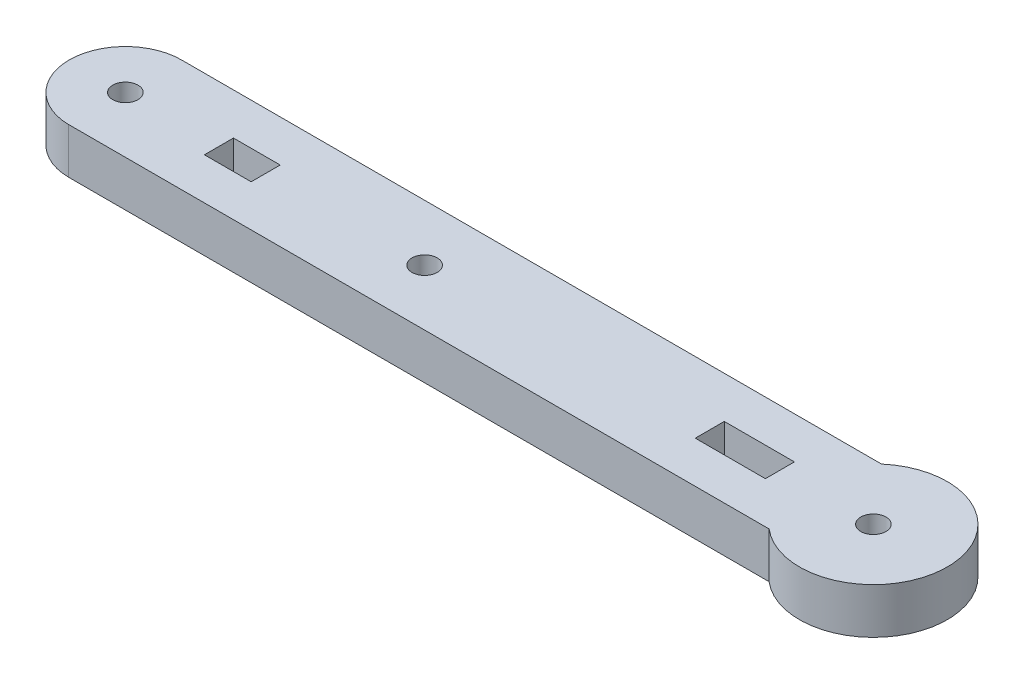
ISO-10303-21;
HEADER;
FILE_DESCRIPTION(('STEP AP214'),'2;1');
FILE_NAME('part.step','',(''),(''),'','','');
FILE_SCHEMA(('AUTOMOTIVE_DESIGN { 1 0 10303 214 1 1 1 1 }'));
ENDSEC;
DATA;
#1=APPLICATION_CONTEXT('core data for automotive mechanical design processes');
#2=APPLICATION_PROTOCOL_DEFINITION('international standard','automotive_design',2000,#1);
#3=PRODUCT_CONTEXT('',#1,'mechanical');
#4=PRODUCT('Part','Part','',(#3));
#5=PRODUCT_RELATED_PRODUCT_CATEGORY('part','',(#4));
#6=PRODUCT_DEFINITION_FORMATION('','',#4);
#7=PRODUCT_DEFINITION_CONTEXT('part definition',#1,'design');
#8=PRODUCT_DEFINITION('design','',#6,#7);
#9=PRODUCT_DEFINITION_SHAPE('','',#8);
#10=(LENGTH_UNIT() NAMED_UNIT(*) SI_UNIT(.MILLI.,.METRE.));
#11=(NAMED_UNIT(*) PLANE_ANGLE_UNIT() SI_UNIT($,.RADIAN.));
#12=(NAMED_UNIT(*) SI_UNIT($,.STERADIAN.) SOLID_ANGLE_UNIT());
#13=UNCERTAINTY_MEASURE_WITH_UNIT(LENGTH_MEASURE(1.E-05),#10,'distance_accuracy_value','');
#14=(GEOMETRIC_REPRESENTATION_CONTEXT(3) GLOBAL_UNCERTAINTY_ASSIGNED_CONTEXT((#13)) GLOBAL_UNIT_ASSIGNED_CONTEXT((#10,
#11,#12)) REPRESENTATION_CONTEXT('',''));
#15=CARTESIAN_POINT('',(0.,0.,0.));
#16=DIRECTION('',(0.,0.,1.));
#17=DIRECTION('',(1.,0.,0.));
#18=AXIS2_PLACEMENT_3D('',#15,#16,#17);
#19=CARTESIAN_POINT('',(23.2287023390992,3.175,-0.467530016388515));
#20=DIRECTION('',(0.,1.,0.));
#21=DIRECTION('',(0.,0.,1.));
#22=AXIS2_PLACEMENT_3D('',#19,#20,#21);
#23=PLANE('',#22);
#24=CARTESIAN_POINT('',(-7.95164639462266,3.175,-0.467466464512428));
#25=DIRECTION('',(0.,1.,0.));
#26=DIRECTION('',(0.,0.,1.));
#27=AXIS2_PLACEMENT_3D('',#24,#25,#26);
#28=CIRCLE('',#27,0.8763);
#29=CARTESIAN_POINT('',(-7.95164639462266,3.175,0.408833535487572));
#30=VERTEX_POINT('',#29);
#31=EDGE_CURVE('E195',#30,#30,#28,.T.);
#32=ORIENTED_EDGE('',*,*,#31,.F.);
#33=EDGE_LOOP('',(#32));
#34=FACE_BOUND('',#33,.T.);
#35=CARTESIAN_POINT('',(23.2287023390992,3.175,-0.467530016388515));
#36=DIRECTION('',(0.,1.,0.));
#37=DIRECTION('',(0.,0.,1.));
#38=AXIS2_PLACEMENT_3D('',#35,#36,#37);
#39=CIRCLE('',#38,5.13978734146582);
#40=CARTESIAN_POINT('',(19.8863824578508,3.175,3.4371225580288));
#41=VERTEX_POINT('',#40);
#42=CARTESIAN_POINT('',(19.8863385041055,3.175,-4.37214496667731));
#43=VERTEX_POINT('',#42);
#44=EDGE_CURVE('E207',#41,#43,#39,.T.);
#45=ORIENTED_EDGE('',*,*,#44,.T.);
#46=DIRECTION('',(-1.,0.,0.));
#47=VECTOR('',#46,1.);
#48=CARTESIAN_POINT('',(-28.7424793651974,3.175,-4.37214496667731));
#49=LINE('',#48,#47);
#50=CARTESIAN_POINT('',(-28.7424793651974,3.175,-4.37214496667731));
#51=VERTEX_POINT('',#50);
#52=EDGE_CURVE('E210',#43,#51,#49,.T.);
#53=ORIENTED_EDGE('',*,*,#52,.T.);
#54=CARTESIAN_POINT('',(-28.7424793651974,3.175,-0.467532216526747));
#55=DIRECTION('',(0.,1.,0.));
#56=DIRECTION('',(0.,0.,1.));
#57=AXIS2_PLACEMENT_3D('',#54,#55,#56);
#58=CIRCLE('',#57,3.90461275015056);
#59=CARTESIAN_POINT('',(-28.7899401638538,3.175,3.43679207856315));
#60=VERTEX_POINT('',#59);
#61=EDGE_CURVE('E213',#51,#60,#58,.T.);
#62=ORIENTED_EDGE('',*,*,#61,.T.);
#63=DIRECTION('',(0.999999999976952,0.,6.78932688101852E-06));
#64=VECTOR('',#63,1.);
#65=CARTESIAN_POINT('',(19.8863824578508,3.175,3.4371225580288));
#66=LINE('',#65,#64);
#67=EDGE_CURVE('E215',#60,#41,#66,.T.);
#68=ORIENTED_EDGE('',*,*,#67,.T.);
#69=EDGE_LOOP('',(#45,#53,#62,#68));
#70=FACE_BOUND('',#69,.T.);
#71=CARTESIAN_POINT('',(-28.7424793651974,3.175,-0.467532216526747));
#72=DIRECTION('',(0.,1.,0.));
#73=DIRECTION('',(0.,0.,1.));
#74=AXIS2_PLACEMENT_3D('',#71,#72,#73);
#75=CIRCLE('',#74,0.876299999999999);
#76=CARTESIAN_POINT('',(-28.7424793651974,3.175,0.408767783473251));
#77=VERTEX_POINT('',#76);
#78=EDGE_CURVE('E201',#77,#77,#75,.T.);
#79=ORIENTED_EDGE('',*,*,#78,.F.);
#80=EDGE_LOOP('',(#79));
#81=FACE_BOUND('',#80,.T.);
#82=CARTESIAN_POINT('',(23.2287023390992,3.175,-0.467530016388515));
#83=DIRECTION('',(0.,1.,0.));
#84=DIRECTION('',(0.,0.,1.));
#85=AXIS2_PLACEMENT_3D('',#82,#83,#84);
#86=CIRCLE('',#85,0.876299999999999);
#87=CARTESIAN_POINT('',(23.2287023390992,3.175,0.408769983611484));
#88=VERTEX_POINT('',#87);
#89=EDGE_CURVE('E189',#88,#88,#86,.T.);
#90=ORIENTED_EDGE('',*,*,#89,.F.);
#91=EDGE_LOOP('',(#90));
#92=FACE_BOUND('',#91,.T.);
#93=DIRECTION('',(0.,0.,-1.));
#94=VECTOR('',#93,1.);
#95=CARTESIAN_POINT('',(-18.9945385812609,3.175,0.508687145532404));
#96=LINE('',#95,#94);
#97=CARTESIAN_POINT('',(-18.9945385812609,3.175,0.541137471946843));
#98=VERTEX_POINT('',#97);
#99=CARTESIAN_POINT('',(-18.9945385812609,3.175,-1.47619750881385));
#100=VERTEX_POINT('',#99);
#101=EDGE_CURVE('E163',#98,#100,#96,.T.);
#102=ORIENTED_EDGE('',*,*,#101,.F.);
#103=DIRECTION('',(1.,0.,0.));
#104=VECTOR('',#103,1.);
#105=CARTESIAN_POINT('',(-18.9945385812609,3.175,0.541137471946843));
#106=LINE('',#105,#104);
#107=CARTESIAN_POINT('',(-22.2425017839692,3.175,0.541137471946843));
#108=VERTEX_POINT('',#107);
#109=EDGE_CURVE('E160',#108,#98,#106,.T.);
#110=ORIENTED_EDGE('',*,*,#109,.F.);
#111=DIRECTION('',(0.,0.,1.));
#112=VECTOR('',#111,1.);
#113=CARTESIAN_POINT('',(-22.2425017839692,3.175,0.508687145532223));
#114=LINE('',#113,#112);
#115=CARTESIAN_POINT('',(-22.2425017839692,3.175,-1.47619750881385));
#116=VERTEX_POINT('',#115);
#117=EDGE_CURVE('E158',#116,#108,#114,.T.);
#118=ORIENTED_EDGE('',*,*,#117,.F.);
#119=DIRECTION('',(-1.,0.,0.));
#120=VECTOR('',#119,1.);
#121=CARTESIAN_POINT('',(-22.2425017839692,3.175,-1.47619750881385));
#122=LINE('',#121,#120);
#123=EDGE_CURVE('E165',#100,#116,#122,.T.);
#124=ORIENTED_EDGE('',*,*,#123,.F.);
#125=EDGE_LOOP('',(#102,#110,#118,#124));
#126=FACE_BOUND('',#125,.T.);
#127=DIRECTION('',(1.,0.,0.));
#128=VECTOR('',#127,1.);
#129=CARTESIAN_POINT('',(16.7328409579905,3.175,0.541137473480425));
#130=LINE('',#129,#128);
#131=CARTESIAN_POINT('',(11.860918357366,3.175,0.541137473480425));
#132=VERTEX_POINT('',#131);
#133=CARTESIAN_POINT('',(16.7328409579905,3.175,0.541137473480425));
#134=VERTEX_POINT('',#133);
#135=EDGE_CURVE('E130',#132,#134,#130,.T.);
#136=ORIENTED_EDGE('',*,*,#135,.F.);
#137=DIRECTION('',(0.,0.,1.));
#138=VECTOR('',#137,1.);
#139=CARTESIAN_POINT('',(11.860918357366,3.175,0.541137473480425));
#140=LINE('',#139,#138);
#141=CARTESIAN_POINT('',(11.860918357366,3.175,-1.47619750728031));
#142=VERTEX_POINT('',#141);
#143=EDGE_CURVE('E122',#142,#132,#140,.T.);
#144=ORIENTED_EDGE('',*,*,#143,.F.);
#145=DIRECTION('',(-1.,0.,0.));
#146=VECTOR('',#145,1.);
#147=CARTESIAN_POINT('',(11.860918357366,3.175,-1.47619750728031));
#148=LINE('',#147,#146);
#149=CARTESIAN_POINT('',(16.7328409579905,3.175,-1.47619750728031));
#150=VERTEX_POINT('',#149);
#151=EDGE_CURVE('E144',#150,#142,#148,.T.);
#152=ORIENTED_EDGE('',*,*,#151,.F.);
#153=DIRECTION('',(0.,0.,-1.));
#154=VECTOR('',#153,1.);
#155=CARTESIAN_POINT('',(16.7328409579905,3.175,-1.47619750728031));
#156=LINE('',#155,#154);
#157=EDGE_CURVE('E142',#134,#150,#156,.T.);
#158=ORIENTED_EDGE('',*,*,#157,.F.);
#159=EDGE_LOOP('',(#136,#144,#152,#158));
#160=FACE_BOUND('',#159,.T.);
#161=ADVANCED_FACE('F33',(#34,#70,#81,#92,#126,#160),#23,.T.);
#162=CARTESIAN_POINT('',(23.2287023390992,0.,-0.467530016388515));
#163=DIRECTION('',(0.,1.,0.));
#164=DIRECTION('',(0.,0.,1.));
#165=AXIS2_PLACEMENT_3D('',#162,#163,#164);
#166=PLANE('',#165);
#167=DIRECTION('',(1.,0.,0.));
#168=VECTOR('',#167,1.);
#169=CARTESIAN_POINT('',(-18.9945385812609,0.,0.541137471946843));
#170=LINE('',#169,#168);
#171=CARTESIAN_POINT('',(-22.2425017839692,0.,0.541137471946843));
#172=VERTEX_POINT('',#171);
#173=CARTESIAN_POINT('',(-18.9945385812609,0.,0.541137471946843));
#174=VERTEX_POINT('',#173);
#175=EDGE_CURVE('E138',#172,#174,#170,.T.);
#176=ORIENTED_EDGE('',*,*,#175,.T.);
#177=DIRECTION('',(0.,0.,-1.));
#178=VECTOR('',#177,1.);
#179=CARTESIAN_POINT('',(-18.9945385812609,0.,-1.47619750881385));
#180=LINE('',#179,#178);
#181=CARTESIAN_POINT('',(-18.9945385812609,0.,-1.47619750881385));
#182=VERTEX_POINT('',#181);
#183=EDGE_CURVE('E171',#174,#182,#180,.T.);
#184=ORIENTED_EDGE('',*,*,#183,.T.);
#185=DIRECTION('',(-1.,0.,0.));
#186=VECTOR('',#185,1.);
#187=CARTESIAN_POINT('',(-22.2425017839692,0.,-1.47619750881385));
#188=LINE('',#187,#186);
#189=CARTESIAN_POINT('',(-22.2425017839692,0.,-1.47619750881385));
#190=VERTEX_POINT('',#189);
#191=EDGE_CURVE('E174',#182,#190,#188,.T.);
#192=ORIENTED_EDGE('',*,*,#191,.T.);
#193=DIRECTION('',(0.,0.,1.));
#194=VECTOR('',#193,1.);
#195=CARTESIAN_POINT('',(-22.2425017839692,0.,-1.44362007575488));
#196=LINE('',#195,#194);
#197=EDGE_CURVE('E161',#190,#172,#196,.T.);
#198=ORIENTED_EDGE('',*,*,#197,.T.);
#199=EDGE_LOOP('',(#176,#184,#192,#198));
#200=FACE_BOUND('',#199,.T.);
#201=CARTESIAN_POINT('',(23.2287023390992,0.,-0.467530016388515));
#202=DIRECTION('',(0.,1.,0.));
#203=DIRECTION('',(0.,0.,1.));
#204=AXIS2_PLACEMENT_3D('',#201,#202,#203);
#205=CIRCLE('',#204,5.13978734146582);
#206=CARTESIAN_POINT('',(19.8863824578508,0.,3.4371225580288));
#207=VERTEX_POINT('',#206);
#208=CARTESIAN_POINT('',(19.8863385041055,0.,-4.37214496667731));
#209=VERTEX_POINT('',#208);
#210=EDGE_CURVE('E204',#207,#209,#205,.T.);
#211=ORIENTED_EDGE('',*,*,#210,.F.);
#212=DIRECTION('',(0.999999999976952,0.,6.78932688101852E-06));
#213=VECTOR('',#212,1.);
#214=CARTESIAN_POINT('',(19.8863824578508,0.,3.4371225580288));
#215=LINE('',#214,#213);
#216=CARTESIAN_POINT('',(-28.7899401638538,0.,3.43679207856315));
#217=VERTEX_POINT('',#216);
#218=EDGE_CURVE('E211',#217,#207,#215,.T.);
#219=ORIENTED_EDGE('',*,*,#218,.F.);
#220=CARTESIAN_POINT('',(-28.7424793651974,0.,-0.467532216526747));
#221=DIRECTION('',(0.,1.,0.));
#222=DIRECTION('',(0.,0.,1.));
#223=AXIS2_PLACEMENT_3D('',#220,#221,#222);
#224=CIRCLE('',#223,3.90461275015056);
#225=CARTESIAN_POINT('',(-28.7424793651974,0.,-4.37214496667731));
#226=VERTEX_POINT('',#225);
#227=EDGE_CURVE('E222',#226,#217,#224,.T.);
#228=ORIENTED_EDGE('',*,*,#227,.F.);
#229=DIRECTION('',(-1.,0.,0.));
#230=VECTOR('',#229,1.);
#231=CARTESIAN_POINT('',(-28.7424793651974,0.,-4.37214496667731));
#232=LINE('',#231,#230);
#233=EDGE_CURVE('E220',#209,#226,#232,.T.);
#234=ORIENTED_EDGE('',*,*,#233,.F.);
#235=EDGE_LOOP('',(#211,#219,#228,#234));
#236=FACE_BOUND('',#235,.T.);
#237=CARTESIAN_POINT('',(-28.7424793651974,0.,-0.467532216526747));
#238=DIRECTION('',(0.,1.,0.));
#239=DIRECTION('',(0.,0.,1.));
#240=AXIS2_PLACEMENT_3D('',#237,#238,#239);
#241=CIRCLE('',#240,0.876299999999999);
#242=CARTESIAN_POINT('',(-28.7424793651974,0.,0.408767783473251));
#243=VERTEX_POINT('',#242);
#244=EDGE_CURVE('E198',#243,#243,#241,.T.);
#245=ORIENTED_EDGE('',*,*,#244,.T.);
#246=EDGE_LOOP('',(#245));
#247=FACE_BOUND('',#246,.T.);
#248=CARTESIAN_POINT('',(-7.95164639462266,0.,-0.467466464512428));
#249=DIRECTION('',(0.,1.,0.));
#250=DIRECTION('',(0.,0.,1.));
#251=AXIS2_PLACEMENT_3D('',#248,#249,#250);
#252=CIRCLE('',#251,0.8763);
#253=CARTESIAN_POINT('',(-7.95164639462266,0.,0.408833535487572));
#254=VERTEX_POINT('',#253);
#255=EDGE_CURVE('E192',#254,#254,#252,.T.);
#256=ORIENTED_EDGE('',*,*,#255,.T.);
#257=EDGE_LOOP('',(#256));
#258=FACE_BOUND('',#257,.T.);
#259=CARTESIAN_POINT('',(23.2287023390992,0.,-0.467530016388515));
#260=DIRECTION('',(0.,1.,0.));
#261=DIRECTION('',(0.,0.,1.));
#262=AXIS2_PLACEMENT_3D('',#259,#260,#261);
#263=CIRCLE('',#262,0.876299999999999);
#264=CARTESIAN_POINT('',(23.2287023390992,0.,0.408769983611484));
#265=VERTEX_POINT('',#264);
#266=EDGE_CURVE('E188',#265,#265,#263,.T.);
#267=ORIENTED_EDGE('',*,*,#266,.T.);
#268=EDGE_LOOP('',(#267));
#269=FACE_BOUND('',#268,.T.);
#270=DIRECTION('',(0.,0.,1.));
#271=VECTOR('',#270,1.);
#272=CARTESIAN_POINT('',(11.860918357366,0.,0.541137473480425));
#273=LINE('',#272,#271);
#274=CARTESIAN_POINT('',(11.860918357366,0.,-1.47619750728031));
#275=VERTEX_POINT('',#274);
#276=CARTESIAN_POINT('',(11.860918357366,0.,0.541137473480425));
#277=VERTEX_POINT('',#276);
#278=EDGE_CURVE('E56',#275,#277,#273,.T.);
#279=ORIENTED_EDGE('',*,*,#278,.T.);
#280=DIRECTION('',(1.,0.,0.));
#281=VECTOR('',#280,1.);
#282=CARTESIAN_POINT('',(16.7328409579905,0.,0.541137473480425));
#283=LINE('',#282,#281);
#284=CARTESIAN_POINT('',(16.7328409579905,0.,0.541137473480425));
#285=VERTEX_POINT('',#284);
#286=EDGE_CURVE('E137',#277,#285,#283,.T.);
#287=ORIENTED_EDGE('',*,*,#286,.T.);
#288=DIRECTION('',(0.,0.,-1.));
#289=VECTOR('',#288,1.);
#290=CARTESIAN_POINT('',(16.7328409579905,0.,-1.47619750728031));
#291=LINE('',#290,#289);
#292=CARTESIAN_POINT('',(16.7328409579905,0.,-1.47619750728031));
#293=VERTEX_POINT('',#292);
#294=EDGE_CURVE('E150',#285,#293,#291,.T.);
#295=ORIENTED_EDGE('',*,*,#294,.T.);
#296=DIRECTION('',(-1.,0.,0.));
#297=VECTOR('',#296,1.);
#298=CARTESIAN_POINT('',(11.860918357366,0.,-1.47619750728031));
#299=LINE('',#298,#297);
#300=EDGE_CURVE('E131',#293,#275,#299,.T.);
#301=ORIENTED_EDGE('',*,*,#300,.T.);
#302=EDGE_LOOP('',(#279,#287,#295,#301));
#303=FACE_BOUND('',#302,.T.);
#304=ADVANCED_FACE('F240',(#200,#236,#247,#258,#269,#303),#166,.F.);
#305=CARTESIAN_POINT('',(23.2287023390992,3.175,-0.467530016388515));
#306=DIRECTION('',(0.,-1.,0.));
#307=DIRECTION('',(0.,0.,-1.));
#308=AXIS2_PLACEMENT_3D('',#305,#306,#307);
#309=CYLINDRICAL_SURFACE('',#308,5.13978734146582);
#310=ORIENTED_EDGE('',*,*,#210,.T.);
#311=DIRECTION('',(0.,-1.,0.));
#312=VECTOR('',#311,1.);
#313=CARTESIAN_POINT('',(19.8863385041055,3.175,-4.37214496667731));
#314=LINE('',#313,#312);
#315=EDGE_CURVE('E11',#43,#209,#314,.T.);
#316=ORIENTED_EDGE('',*,*,#315,.F.);
#317=ORIENTED_EDGE('',*,*,#44,.F.);
#318=DIRECTION('',(0.,-1.,0.));
#319=VECTOR('',#318,1.);
#320=CARTESIAN_POINT('',(19.8863824578508,3.175,3.4371225580288));
#321=LINE('',#320,#319);
#322=EDGE_CURVE('E217',#41,#207,#321,.T.);
#323=ORIENTED_EDGE('',*,*,#322,.T.);
#324=EDGE_LOOP('',(#310,#316,#317,#323));
#325=FACE_BOUND('',#324,.T.);
#326=ADVANCED_FACE('F35',(#325),#309,.T.);
#327=CARTESIAN_POINT('',(-28.7424793651974,3.175,-4.37214496667731));
#328=DIRECTION('',(0.,0.,1.));
#329=DIRECTION('',(1.,0.,0.));
#330=AXIS2_PLACEMENT_3D('',#327,#328,#329);
#331=PLANE('',#330);
#332=ORIENTED_EDGE('',*,*,#233,.T.);
#333=DIRECTION('',(0.,-1.,0.));
#334=VECTOR('',#333,1.);
#335=CARTESIAN_POINT('',(-28.7424793651974,3.175,-4.37214496667731));
#336=LINE('',#335,#334);
#337=EDGE_CURVE('E41',#51,#226,#336,.T.);
#338=ORIENTED_EDGE('',*,*,#337,.F.);
#339=ORIENTED_EDGE('',*,*,#52,.F.);
#340=ORIENTED_EDGE('',*,*,#315,.T.);
#341=EDGE_LOOP('',(#332,#338,#339,#340));
#342=FACE_BOUND('',#341,.T.);
#343=ADVANCED_FACE('F251',(#342),#331,.F.);
#344=CARTESIAN_POINT('',(-28.7424793651974,3.175,-0.467532216526747));
#345=DIRECTION('',(0.,-1.,0.));
#346=DIRECTION('',(0.,0.,-1.));
#347=AXIS2_PLACEMENT_3D('',#344,#345,#346);
#348=CYLINDRICAL_SURFACE('',#347,3.90461275015056);
#349=ORIENTED_EDGE('',*,*,#227,.T.);
#350=DIRECTION('',(0.,-1.,0.));
#351=VECTOR('',#350,1.);
#352=CARTESIAN_POINT('',(-28.7899401638538,3.175,3.43679207856315));
#353=LINE('',#352,#351);
#354=EDGE_CURVE('E227',#60,#217,#353,.T.);
#355=ORIENTED_EDGE('',*,*,#354,.F.);
#356=ORIENTED_EDGE('',*,*,#61,.F.);
#357=ORIENTED_EDGE('',*,*,#337,.T.);
#358=EDGE_LOOP('',(#349,#355,#356,#357));
#359=FACE_BOUND('',#358,.T.);
#360=ADVANCED_FACE('F234',(#359),#348,.T.);
#361=CARTESIAN_POINT('',(19.8863824578508,3.175,3.4371225580288));
#362=DIRECTION('',(6.78932688101852E-06,0.,-0.999999999976953));
#363=DIRECTION('',(-0.999999999976953,0.,-6.78932688101852E-06));
#364=AXIS2_PLACEMENT_3D('',#361,#362,#363);
#365=PLANE('',#364);
#366=ORIENTED_EDGE('',*,*,#218,.T.);
#367=ORIENTED_EDGE('',*,*,#322,.F.);
#368=ORIENTED_EDGE('',*,*,#67,.F.);
#369=ORIENTED_EDGE('',*,*,#354,.T.);
#370=EDGE_LOOP('',(#366,#367,#368,#369));
#371=FACE_BOUND('',#370,.T.);
#372=ADVANCED_FACE('F244',(#371),#365,.F.);
#373=CARTESIAN_POINT('',(-28.7424793651974,3.175,-0.467532216526747));
#374=DIRECTION('',(0.,-1.,0.));
#375=DIRECTION('',(0.,0.,-1.));
#376=AXIS2_PLACEMENT_3D('',#373,#374,#375);
#377=CYLINDRICAL_SURFACE('',#376,0.876299999999999);
#378=ORIENTED_EDGE('',*,*,#78,.T.);
#379=EDGE_LOOP('',(#378));
#380=FACE_BOUND('',#379,.T.);
#381=ORIENTED_EDGE('',*,*,#244,.F.);
#382=EDGE_LOOP('',(#381));
#383=FACE_BOUND('',#382,.T.);
#384=ADVANCED_FACE('F268',(#380,#383),#377,.F.);
#385=CARTESIAN_POINT('',(-7.95164639462266,3.175,-0.467466464512428));
#386=DIRECTION('',(0.,-1.,0.));
#387=DIRECTION('',(0.,0.,-1.));
#388=AXIS2_PLACEMENT_3D('',#385,#386,#387);
#389=CYLINDRICAL_SURFACE('',#388,0.8763);
#390=ORIENTED_EDGE('',*,*,#31,.T.);
#391=EDGE_LOOP('',(#390));
#392=FACE_BOUND('',#391,.T.);
#393=ORIENTED_EDGE('',*,*,#255,.F.);
#394=EDGE_LOOP('',(#393));
#395=FACE_BOUND('',#394,.T.);
#396=ADVANCED_FACE('F275',(#392,#395),#389,.F.);
#397=CARTESIAN_POINT('',(23.2287023390992,3.175,-0.467530016388515));
#398=DIRECTION('',(0.,-1.,0.));
#399=DIRECTION('',(0.,0.,-1.));
#400=AXIS2_PLACEMENT_3D('',#397,#398,#399);
#401=CYLINDRICAL_SURFACE('',#400,0.876299999999999);
#402=ORIENTED_EDGE('',*,*,#89,.T.);
#403=EDGE_LOOP('',(#402));
#404=FACE_BOUND('',#403,.T.);
#405=ORIENTED_EDGE('',*,*,#266,.F.);
#406=EDGE_LOOP('',(#405));
#407=FACE_BOUND('',#406,.T.);
#408=ADVANCED_FACE('F280',(#404,#407),#401,.F.);
#409=CARTESIAN_POINT('',(-18.9945385812609,3.175,0.541137471946843));
#410=DIRECTION('',(0.,0.,-1.));
#411=DIRECTION('',(-1.,0.,0.));
#412=AXIS2_PLACEMENT_3D('',#409,#410,#411);
#413=PLANE('',#412);
#414=ORIENTED_EDGE('',*,*,#175,.F.);
#415=DIRECTION('',(0.,-1.,0.));
#416=VECTOR('',#415,1.);
#417=CARTESIAN_POINT('',(-22.2425017839692,3.175,0.541137471946843));
#418=LINE('',#417,#416);
#419=EDGE_CURVE('E185',#108,#172,#418,.T.);
#420=ORIENTED_EDGE('',*,*,#419,.F.);
#421=ORIENTED_EDGE('',*,*,#109,.T.);
#422=DIRECTION('',(0.,-1.,0.));
#423=VECTOR('',#422,1.);
#424=CARTESIAN_POINT('',(-18.9945385812609,3.175,0.541137471946843));
#425=LINE('',#424,#423);
#426=EDGE_CURVE('E182',#98,#174,#425,.T.);
#427=ORIENTED_EDGE('',*,*,#426,.T.);
#428=EDGE_LOOP('',(#414,#420,#421,#427));
#429=FACE_BOUND('',#428,.T.);
#430=ADVANCED_FACE('F316',(#429),#413,.T.);
#431=CARTESIAN_POINT('',(-18.9945385812609,3.175,-1.47619750881385));
#432=DIRECTION('',(-1.,0.,0.));
#433=DIRECTION('',(0.,0.,1.));
#434=AXIS2_PLACEMENT_3D('',#431,#432,#433);
#435=PLANE('',#434);
#436=ORIENTED_EDGE('',*,*,#183,.F.);
#437=ORIENTED_EDGE('',*,*,#426,.F.);
#438=ORIENTED_EDGE('',*,*,#101,.T.);
#439=DIRECTION('',(0.,-1.,0.));
#440=VECTOR('',#439,1.);
#441=CARTESIAN_POINT('',(-18.9945385812609,3.175,-1.47619750881385));
#442=LINE('',#441,#440);
#443=EDGE_CURVE('E180',#100,#182,#442,.T.);
#444=ORIENTED_EDGE('',*,*,#443,.T.);
#445=EDGE_LOOP('',(#436,#437,#438,#444));
#446=FACE_BOUND('',#445,.T.);
#447=ADVANCED_FACE('F312',(#446),#435,.T.);
#448=CARTESIAN_POINT('',(-22.2425017839692,3.175,-1.47619750881385));
#449=DIRECTION('',(0.,0.,1.));
#450=DIRECTION('',(1.,0.,0.));
#451=AXIS2_PLACEMENT_3D('',#448,#449,#450);
#452=PLANE('',#451);
#453=ORIENTED_EDGE('',*,*,#191,.F.);
#454=ORIENTED_EDGE('',*,*,#443,.F.);
#455=ORIENTED_EDGE('',*,*,#123,.T.);
#456=DIRECTION('',(0.,-1.,0.));
#457=VECTOR('',#456,1.);
#458=CARTESIAN_POINT('',(-22.2425017839692,3.175,-1.47619750881385));
#459=LINE('',#458,#457);
#460=EDGE_CURVE('E168',#116,#190,#459,.T.);
#461=ORIENTED_EDGE('',*,*,#460,.T.);
#462=EDGE_LOOP('',(#453,#454,#455,#461));
#463=FACE_BOUND('',#462,.T.);
#464=ADVANCED_FACE('F308',(#463),#452,.T.);
#465=CARTESIAN_POINT('',(-22.2425017839692,3.175,-1.44362007575488));
#466=DIRECTION('',(1.,0.,0.));
#467=DIRECTION('',(0.,0.,-1.));
#468=AXIS2_PLACEMENT_3D('',#465,#466,#467);
#469=PLANE('',#468);
#470=ORIENTED_EDGE('',*,*,#197,.F.);
#471=ORIENTED_EDGE('',*,*,#460,.F.);
#472=ORIENTED_EDGE('',*,*,#117,.T.);
#473=ORIENTED_EDGE('',*,*,#419,.T.);
#474=EDGE_LOOP('',(#470,#471,#472,#473));
#475=FACE_BOUND('',#474,.T.);
#476=ADVANCED_FACE('F305',(#475),#469,.T.);
#477=CARTESIAN_POINT('',(11.860918357366,3.175,0.541137473480425));
#478=DIRECTION('',(1.,0.,0.));
#479=DIRECTION('',(0.,0.,-1.));
#480=AXIS2_PLACEMENT_3D('',#477,#478,#479);
#481=PLANE('',#480);
#482=ORIENTED_EDGE('',*,*,#278,.F.);
#483=DIRECTION('',(0.,-1.,0.));
#484=VECTOR('',#483,1.);
#485=CARTESIAN_POINT('',(11.860918357366,3.175,-1.47619750728031));
#486=LINE('',#485,#484);
#487=EDGE_CURVE('E126',#142,#275,#486,.T.);
#488=ORIENTED_EDGE('',*,*,#487,.F.);
#489=ORIENTED_EDGE('',*,*,#143,.T.);
#490=DIRECTION('',(0.,-1.,0.));
#491=VECTOR('',#490,1.);
#492=CARTESIAN_POINT('',(11.860918357366,3.175,0.541137473480425));
#493=LINE('',#492,#491);
#494=EDGE_CURVE('E125',#132,#277,#493,.T.);
#495=ORIENTED_EDGE('',*,*,#494,.T.);
#496=EDGE_LOOP('',(#482,#488,#489,#495));
#497=FACE_BOUND('',#496,.T.);
#498=ADVANCED_FACE('F124',(#497),#481,.T.);
#499=CARTESIAN_POINT('',(16.7328409579905,3.175,0.541137473480425));
#500=DIRECTION('',(0.,0.,-1.));
#501=DIRECTION('',(-1.,0.,0.));
#502=AXIS2_PLACEMENT_3D('',#499,#500,#501);
#503=PLANE('',#502);
#504=ORIENTED_EDGE('',*,*,#286,.F.);
#505=ORIENTED_EDGE('',*,*,#494,.F.);
#506=ORIENTED_EDGE('',*,*,#135,.T.);
#507=DIRECTION('',(0.,-1.,0.));
#508=VECTOR('',#507,1.);
#509=CARTESIAN_POINT('',(16.7328409579905,3.175,0.541137473480425));
#510=LINE('',#509,#508);
#511=EDGE_CURVE('E139',#134,#285,#510,.T.);
#512=ORIENTED_EDGE('',*,*,#511,.T.);
#513=EDGE_LOOP('',(#504,#505,#506,#512));
#514=FACE_BOUND('',#513,.T.);
#515=ADVANCED_FACE('F134',(#514),#503,.T.);
#516=CARTESIAN_POINT('',(16.7328409579905,3.175,-1.47619750728031));
#517=DIRECTION('',(-1.,0.,0.));
#518=DIRECTION('',(0.,0.,1.));
#519=AXIS2_PLACEMENT_3D('',#516,#517,#518);
#520=PLANE('',#519);
#521=ORIENTED_EDGE('',*,*,#294,.F.);
#522=ORIENTED_EDGE('',*,*,#511,.F.);
#523=ORIENTED_EDGE('',*,*,#157,.T.);
#524=DIRECTION('',(0.,-1.,0.));
#525=VECTOR('',#524,1.);
#526=CARTESIAN_POINT('',(16.7328409579905,3.175,-1.47619750728031));
#527=LINE('',#526,#525);
#528=EDGE_CURVE('E48',#150,#293,#527,.T.);
#529=ORIENTED_EDGE('',*,*,#528,.T.);
#530=EDGE_LOOP('',(#521,#522,#523,#529));
#531=FACE_BOUND('',#530,.T.);
#532=ADVANCED_FACE('F293',(#531),#520,.T.);
#533=CARTESIAN_POINT('',(11.860918357366,3.175,-1.47619750728031));
#534=DIRECTION('',(0.,0.,1.));
#535=DIRECTION('',(1.,0.,0.));
#536=AXIS2_PLACEMENT_3D('',#533,#534,#535);
#537=PLANE('',#536);
#538=ORIENTED_EDGE('',*,*,#300,.F.);
#539=ORIENTED_EDGE('',*,*,#528,.F.);
#540=ORIENTED_EDGE('',*,*,#151,.T.);
#541=ORIENTED_EDGE('',*,*,#487,.T.);
#542=EDGE_LOOP('',(#538,#539,#540,#541));
#543=FACE_BOUND('',#542,.T.);
#544=ADVANCED_FACE('F291',(#543),#537,.T.);
#545=CLOSED_SHELL('',(#161,#304,#326,#343,#360,#372,#384,#396,#408,#430,#447,#464,#476,#498,
#515,#532,#544));
#546=MANIFOLD_SOLID_BREP('B2',#545);
#547=ADVANCED_BREP_SHAPE_REPRESENTATION('',(#18,#546),#14);
#548=SHAPE_DEFINITION_REPRESENTATION(#9,#547);
ENDSEC;
END-ISO-10303-21;
